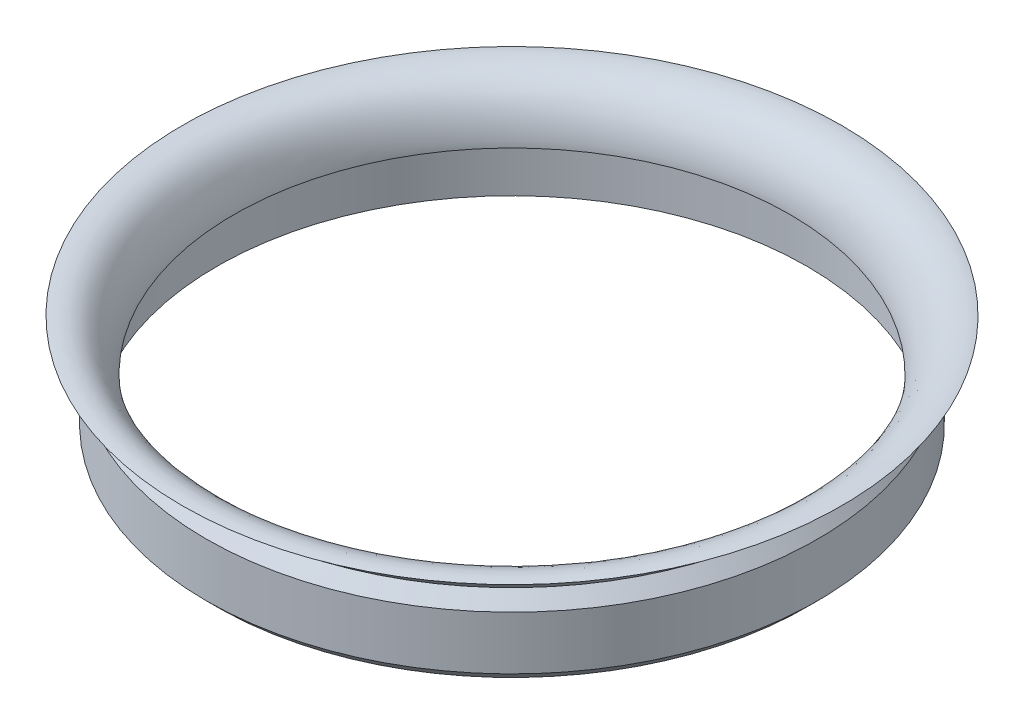
ISO-10303-21;
HEADER;
FILE_DESCRIPTION(('STEP AP214'),'2;1');
FILE_NAME('part.step','',(''),(''),'','','');
FILE_SCHEMA(('AUTOMOTIVE_DESIGN { 1 0 10303 214 1 1 1 1 }'));
ENDSEC;
DATA;
#1=APPLICATION_CONTEXT('core data for automotive mechanical design processes');
#2=APPLICATION_PROTOCOL_DEFINITION('international standard','automotive_design',2000,#1);
#3=PRODUCT_CONTEXT('',#1,'mechanical');
#4=PRODUCT('Part','Part','',(#3));
#5=PRODUCT_RELATED_PRODUCT_CATEGORY('part','',(#4));
#6=PRODUCT_DEFINITION_FORMATION('','',#4);
#7=PRODUCT_DEFINITION_CONTEXT('part definition',#1,'design');
#8=PRODUCT_DEFINITION('design','',#6,#7);
#9=PRODUCT_DEFINITION_SHAPE('','',#8);
#10=(LENGTH_UNIT() NAMED_UNIT(*) SI_UNIT(.MILLI.,.METRE.));
#11=(NAMED_UNIT(*) PLANE_ANGLE_UNIT() SI_UNIT($,.RADIAN.));
#12=(NAMED_UNIT(*) SI_UNIT($,.STERADIAN.) SOLID_ANGLE_UNIT());
#13=UNCERTAINTY_MEASURE_WITH_UNIT(LENGTH_MEASURE(1.E-05),#10,'distance_accuracy_value','');
#14=(GEOMETRIC_REPRESENTATION_CONTEXT(3) GLOBAL_UNCERTAINTY_ASSIGNED_CONTEXT((#13)) GLOBAL_UNIT_ASSIGNED_CONTEXT((#10,
#11,#12)) REPRESENTATION_CONTEXT('',''));
#15=CARTESIAN_POINT('',(0.,0.,0.));
#16=DIRECTION('',(0.,0.,1.));
#17=DIRECTION('',(1.,0.,0.));
#18=AXIS2_PLACEMENT_3D('',#15,#16,#17);
#19=CARTESIAN_POINT('',(-54.2860225521831,2.00003331112992,0.));
#20=CARTESIAN_POINT('',(-54.3789914047777,2.39814182254062,0.));
#21=CARTESIAN_POINT('',(-54.5949845054208,3.16803069668112,0.));
#22=CARTESIAN_POINT('',(-55.0810979780381,4.3921284366053,0.));
#23=CARTESIAN_POINT('',(-55.7146244595334,5.51057943241265,0.));
#24=CARTESIAN_POINT('',(-56.486197167516,6.44989643578858,0.));
#25=CARTESIAN_POINT('',(-57.3843850852599,7.1493488043475,0.));
#26=CARTESIAN_POINT('',(-58.2483268855817,7.52550779093758,0.));
#27=CARTESIAN_POINT('',(-59.1094970529376,7.69656473831123,0.));
#28=CARTESIAN_POINT('',(-59.8499728031409,7.75601761215621,0.));
#29=CARTESIAN_POINT('',(-60.6128034361935,7.73815905630077,0.));
#30=CARTESIAN_POINT('',(-61.0862717874296,7.68187737807981,0.));
#31=CARTESIAN_POINT('',(-61.3247834445877,7.64124786117554,0.));
#32=B_SPLINE_CURVE_WITH_KNOTS('',3,(#19,#20,#21,#22,#23,#24,#25,#26,#27,#28,#29,#30,#31),
.UNSPECIFIED.,.F.,.F.,(4,1,1,1,1,1,1,1,1,1,4),(0.137811932292393,0.197169915512953,
0.256527898733514,0.315885881954074,0.375243865174635,0.434601848395195,0.493959831615756,
0.523638823226036,0.553317814836316,0.582996806446597,0.612675798056877),.UNSPECIFIED.);
#33=CARTESIAN_POINT('',(0.,0.,0.));
#34=DIRECTION('',(0.,-1.,0.));
#35=AXIS1_PLACEMENT('',#33,#34);
#36=SURFACE_OF_REVOLUTION('',#32,#35);
#37=CARTESIAN_POINT('',(0.,7.142384760453,0.));
#38=DIRECTION('',(0.,-1.,0.));
#39=DIRECTION('',(0.,0.,-1.));
#40=AXIS2_PLACEMENT_3D('',#37,#38,#39);
#41=CIRCLE('',#40,57.466304235117);
#42=CARTESIAN_POINT('',(0.,7.142384760453,-57.466304235117));
#43=VERTEX_POINT('',#42);
#44=EDGE_CURVE('E61',#43,#43,#41,.T.);
#45=ORIENTED_EDGE('',*,*,#44,.T.);
#46=EDGE_LOOP('',(#45));
#47=FACE_BOUND('',#46,.T.);
#48=CARTESIAN_POINT('',(0.,4.55240588947667,0.));
#49=DIRECTION('',(0.,-1.,0.));
#50=DIRECTION('',(0.,0.,-1.));
#51=AXIS2_PLACEMENT_3D('',#48,#49,#50);
#52=CIRCLE('',#51,55.193019235761);
#53=CARTESIAN_POINT('',(0.,4.55240588947667,-55.193019235761));
#54=VERTEX_POINT('',#53);
#55=EDGE_CURVE('E10',#54,#54,#52,.T.);
#56=ORIENTED_EDGE('',*,*,#55,.F.);
#57=EDGE_LOOP('',(#56));
#58=FACE_BOUND('',#57,.T.);
#59=ADVANCED_FACE('F32',(#47,#58),#36,.F.);
#60=CARTESIAN_POINT('',(0.,1.99999999999999,0.));
#61=DIRECTION('',(0.,-1.,0.));
#62=DIRECTION('',(0.,0.,-1.));
#63=AXIS2_PLACEMENT_3D('',#60,#61,#62);
#64=CONICAL_SURFACE('',#63,57.2,0.66633709312958);
#65=ORIENTED_EDGE('',*,*,#55,.T.);
#66=EDGE_LOOP('',(#65));
#67=FACE_BOUND('',#66,.T.);
#68=CARTESIAN_POINT('',(0.,1.99999999999999,0.));
#69=DIRECTION('',(0.,-1.,0.));
#70=DIRECTION('',(0.,0.,-1.));
#71=AXIS2_PLACEMENT_3D('',#68,#69,#70);
#72=CIRCLE('',#71,57.2);
#73=CARTESIAN_POINT('',(0.,1.99999999999999,-57.2));
#74=VERTEX_POINT('',#73);
#75=EDGE_CURVE('E39',#74,#74,#72,.T.);
#76=ORIENTED_EDGE('',*,*,#75,.F.);
#77=EDGE_LOOP('',(#76));
#78=FACE_BOUND('',#77,.T.);
#79=ADVANCED_FACE('F94',(#67,#78),#64,.T.);
#80=CARTESIAN_POINT('',(0.,0.,0.));
#81=DIRECTION('',(0.,-1.,0.));
#82=DIRECTION('',(0.,0.,-1.));
#83=AXIS2_PLACEMENT_3D('',#80,#81,#82);
#84=CYLINDRICAL_SURFACE('',#83,57.2);
#85=CARTESIAN_POINT('',(0.,-7.99999999999998,0.));
#86=DIRECTION('',(0.,-1.,0.));
#87=DIRECTION('',(0.,0.,-1.));
#88=AXIS2_PLACEMENT_3D('',#85,#86,#87);
#89=CIRCLE('',#88,57.2);
#90=CARTESIAN_POINT('',(0.,-7.99999999999998,-57.2));
#91=VERTEX_POINT('',#90);
#92=EDGE_CURVE('E43',#91,#91,#89,.T.);
#93=ORIENTED_EDGE('',*,*,#92,.F.);
#94=EDGE_LOOP('',(#93));
#95=FACE_BOUND('',#94,.T.);
#96=ORIENTED_EDGE('',*,*,#75,.T.);
#97=EDGE_LOOP('',(#96));
#98=FACE_BOUND('',#97,.T.);
#99=ADVANCED_FACE('F91',(#95,#98),#84,.T.);
#100=CARTESIAN_POINT('',(0.,-10.,0.));
#101=DIRECTION('',(0.,1.,0.));
#102=DIRECTION('',(0.,0.,1.));
#103=AXIS2_PLACEMENT_3D('',#100,#101,#102);
#104=CONICAL_SURFACE('',#103,55.2,0.785398163397443);
#105=ORIENTED_EDGE('',*,*,#92,.T.);
#106=EDGE_LOOP('',(#105));
#107=FACE_BOUND('',#106,.T.);
#108=CARTESIAN_POINT('',(0.,-10.,0.));
#109=DIRECTION('',(0.,-1.,0.));
#110=DIRECTION('',(0.,0.,-1.));
#111=AXIS2_PLACEMENT_3D('',#108,#109,#110);
#112=CIRCLE('',#111,55.2);
#113=CARTESIAN_POINT('',(0.,-10.,-55.2));
#114=VERTEX_POINT('',#113);
#115=EDGE_CURVE('E47',#114,#114,#112,.T.);
#116=ORIENTED_EDGE('',*,*,#115,.F.);
#117=EDGE_LOOP('',(#116));
#118=FACE_BOUND('',#117,.T.);
#119=ADVANCED_FACE('F87',(#107,#118),#104,.T.);
#120=CARTESIAN_POINT('',(0.,0.,0.));
#121=DIRECTION('',(0.,-1.,0.));
#122=DIRECTION('',(0.,0.,-1.));
#123=AXIS2_PLACEMENT_3D('',#120,#121,#122);
#124=CYLINDRICAL_SURFACE('',#123,55.2);
#125=ORIENTED_EDGE('',*,*,#115,.T.);
#126=EDGE_LOOP('',(#125));
#127=FACE_BOUND('',#126,.T.);
#128=CARTESIAN_POINT('',(0.,-0.803243495117713,0.));
#129=DIRECTION('',(0.,-1.,0.));
#130=DIRECTION('',(0.,0.,-1.));
#131=AXIS2_PLACEMENT_3D('',#128,#129,#130);
#132=CIRCLE('',#131,55.2);
#133=CARTESIAN_POINT('',(0.,-0.803243495117713,-55.2));
#134=VERTEX_POINT('',#133);
#135=EDGE_CURVE('E52',#134,#134,#132,.T.);
#136=ORIENTED_EDGE('',*,*,#135,.F.);
#137=EDGE_LOOP('',(#136));
#138=FACE_BOUND('',#137,.T.);
#139=ADVANCED_FACE('F83',(#127,#138),#124,.F.);
#140=CARTESIAN_POINT('',(0.,0.,0.));
#141=DIRECTION('',(0.,-1.,0.));
#142=DIRECTION('',(0.,0.,-1.));
#143=AXIS2_PLACEMENT_3D('',#140,#141,#142);
#144=CONICAL_SURFACE('',#143,52.,1.32486392226499);
#145=ORIENTED_EDGE('',*,*,#135,.T.);
#146=EDGE_LOOP('',(#145));
#147=FACE_BOUND('',#146,.T.);
#148=CARTESIAN_POINT('',(0.,0.,0.));
#149=DIRECTION('',(0.,-1.,0.));
#150=DIRECTION('',(0.,0.,-1.));
#151=AXIS2_PLACEMENT_3D('',#148,#149,#150);
#152=CIRCLE('',#151,52.);
#153=CARTESIAN_POINT('',(0.,0.,-52.));
#154=VERTEX_POINT('',#153);
#155=EDGE_CURVE('E55',#154,#154,#152,.T.);
#156=ORIENTED_EDGE('',*,*,#155,.F.);
#157=EDGE_LOOP('',(#156));
#158=FACE_BOUND('',#157,.T.);
#159=ADVANCED_FACE('F79',(#147,#158),#144,.F.);
#160=CARTESIAN_POINT('',(-52.,0.,0.));
#161=CARTESIAN_POINT('',(-52.0246139847359,2.00846139257087,0.));
#162=CARTESIAN_POINT('',(-53.3406391341727,9.08135461362126,0.));
#163=CARTESIAN_POINT('',(-59.9048405665466,9.80366299029441,0.));
#164=CARTESIAN_POINT('',(-61.1253409057314,9.70424494337712,0.));
#165=CARTESIAN_POINT('',(-61.6605912985787,9.61307799410297,0.));
#166=B_SPLINE_CURVE_WITH_KNOTS('',3,(#160,#161,#162,#163,#164,#165),.UNSPECIFIED.,.F.,.F.,(4,1,
1,4),(0.,0.497905944976186,0.559173524781874,0.612675798056877),.UNSPECIFIED.);
#167=CARTESIAN_POINT('',(0.,0.,0.));
#168=DIRECTION('',(0.,-1.,0.));
#169=AXIS1_PLACEMENT('',#167,#168);
#170=SURFACE_OF_REVOLUTION('',#166,#169);
#171=CARTESIAN_POINT('',(0.,9.61380363222441,0.));
#172=DIRECTION('',(0.,-1.,0.));
#173=DIRECTION('',(0.,0.,-1.));
#174=AXIS2_PLACEMENT_3D('',#171,#172,#173);
#175=CIRCLE('',#174,61.6563247109473);
#176=CARTESIAN_POINT('',(0.,9.61380363222441,-61.6563247109473));
#177=VERTEX_POINT('',#176);
#178=EDGE_CURVE('E58',#177,#177,#175,.T.);
#179=ORIENTED_EDGE('',*,*,#178,.F.);
#180=EDGE_LOOP('',(#179));
#181=FACE_BOUND('',#180,.T.);
#182=ORIENTED_EDGE('',*,*,#155,.T.);
#183=EDGE_LOOP('',(#182));
#184=FACE_BOUND('',#183,.T.);
#185=ADVANCED_FACE('F74',(#181,#184),#170,.T.);
#186=CARTESIAN_POINT('',(0.,9.61380363222441,0.));
#187=DIRECTION('',(0.,1.,0.));
#188=DIRECTION('',(0.,0.,1.));
#189=AXIS2_PLACEMENT_3D('',#186,#187,#188);
#190=CONICAL_SURFACE('',#189,61.6563247109473,1.03788494849084);
#191=ORIENTED_EDGE('',*,*,#44,.F.);
#192=EDGE_LOOP('',(#191));
#193=FACE_BOUND('',#192,.T.);
#194=ORIENTED_EDGE('',*,*,#178,.T.);
#195=EDGE_LOOP('',(#194));
#196=FACE_BOUND('',#195,.T.);
#197=ADVANCED_FACE('F78',(#193,#196),#190,.T.);
#198=CLOSED_SHELL('',(#59,#79,#99,#119,#139,#159,#185,#197));
#199=MANIFOLD_SOLID_BREP('B2',#198);
#200=ADVANCED_BREP_SHAPE_REPRESENTATION('',(#18,#199),#14);
#201=SHAPE_DEFINITION_REPRESENTATION(#9,#200);
ENDSEC;
END-ISO-10303-21;
